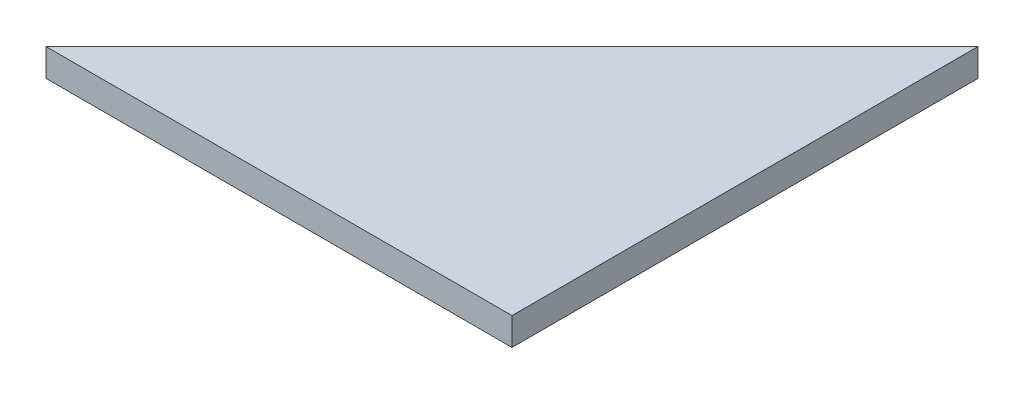
ISO-10303-21;
HEADER;
FILE_DESCRIPTION(('STEP AP214'),'2;1');
FILE_NAME('part.step','',(''),(''),'','','');
FILE_SCHEMA(('AUTOMOTIVE_DESIGN { 1 0 10303 214 1 1 1 1 }'));
ENDSEC;
DATA;
#1=APPLICATION_CONTEXT('core data for automotive mechanical design processes');
#2=APPLICATION_PROTOCOL_DEFINITION('international standard','automotive_design',2000,#1);
#3=PRODUCT_CONTEXT('',#1,'mechanical');
#4=PRODUCT('Part','Part','',(#3));
#5=PRODUCT_RELATED_PRODUCT_CATEGORY('part','',(#4));
#6=PRODUCT_DEFINITION_FORMATION('','',#4);
#7=PRODUCT_DEFINITION_CONTEXT('part definition',#1,'design');
#8=PRODUCT_DEFINITION('design','',#6,#7);
#9=PRODUCT_DEFINITION_SHAPE('','',#8);
#10=(LENGTH_UNIT() NAMED_UNIT(*) SI_UNIT(.MILLI.,.METRE.));
#11=(NAMED_UNIT(*) PLANE_ANGLE_UNIT() SI_UNIT($,.RADIAN.));
#12=(NAMED_UNIT(*) SI_UNIT($,.STERADIAN.) SOLID_ANGLE_UNIT());
#13=UNCERTAINTY_MEASURE_WITH_UNIT(LENGTH_MEASURE(1.E-05),#10,'distance_accuracy_value','');
#14=(GEOMETRIC_REPRESENTATION_CONTEXT(3) GLOBAL_UNCERTAINTY_ASSIGNED_CONTEXT((#13)) GLOBAL_UNIT_ASSIGNED_CONTEXT((#10,
#11,#12)) REPRESENTATION_CONTEXT('',''));
#15=CARTESIAN_POINT('',(0.,0.,0.));
#16=DIRECTION('',(0.,0.,1.));
#17=DIRECTION('',(1.,0.,0.));
#18=AXIS2_PLACEMENT_3D('',#15,#16,#17);
#19=CARTESIAN_POINT('',(53.640001,3.175,0.));
#20=DIRECTION('',(0.,0.,-1.));
#21=DIRECTION('',(-1.,0.,0.));
#22=AXIS2_PLACEMENT_3D('',#19,#20,#21);
#23=PLANE('',#22);
#24=DIRECTION('',(1.,0.,0.));
#25=VECTOR('',#24,1.);
#26=CARTESIAN_POINT('',(53.640001,0.,0.));
#27=LINE('',#26,#25);
#28=CARTESIAN_POINT('',(0.,0.,0.));
#29=VERTEX_POINT('',#28);
#30=CARTESIAN_POINT('',(53.640001,0.,0.));
#31=VERTEX_POINT('',#30);
#32=EDGE_CURVE('E88',#29,#31,#27,.T.);
#33=ORIENTED_EDGE('',*,*,#32,.T.);
#34=DIRECTION('',(0.,-1.,0.));
#35=VECTOR('',#34,1.);
#36=CARTESIAN_POINT('',(53.640001,3.175,0.));
#37=LINE('',#36,#35);
#38=CARTESIAN_POINT('',(53.640001,3.175,0.));
#39=VERTEX_POINT('',#38);
#40=EDGE_CURVE('E11',#39,#31,#37,.T.);
#41=ORIENTED_EDGE('',*,*,#40,.F.);
#42=DIRECTION('',(1.,0.,0.));
#43=VECTOR('',#42,1.);
#44=CARTESIAN_POINT('',(53.640001,3.175,0.));
#45=LINE('',#44,#43);
#46=CARTESIAN_POINT('',(0.,3.175,0.));
#47=VERTEX_POINT('',#46);
#48=EDGE_CURVE('E80',#47,#39,#45,.T.);
#49=ORIENTED_EDGE('',*,*,#48,.F.);
#50=DIRECTION('',(0.,-1.,0.));
#51=VECTOR('',#50,1.);
#52=CARTESIAN_POINT('',(0.,3.175,0.));
#53=LINE('',#52,#51);
#54=EDGE_CURVE('E89',#47,#29,#53,.T.);
#55=ORIENTED_EDGE('',*,*,#54,.T.);
#56=EDGE_LOOP('',(#33,#41,#49,#55));
#57=FACE_BOUND('',#56,.T.);
#58=ADVANCED_FACE('F38',(#57),#23,.F.);
#59=CARTESIAN_POINT('',(53.640001,3.175,-53.6400009999994));
#60=DIRECTION('',(-1.,0.,0.));
#61=DIRECTION('',(0.,0.,1.));
#62=AXIS2_PLACEMENT_3D('',#59,#60,#61);
#63=PLANE('',#62);
#64=DIRECTION('',(0.,0.,-1.));
#65=VECTOR('',#64,1.);
#66=CARTESIAN_POINT('',(53.640001,0.,-53.6400009999994));
#67=LINE('',#66,#65);
#68=CARTESIAN_POINT('',(53.640001,0.,-53.6400009999994));
#69=VERTEX_POINT('',#68);
#70=EDGE_CURVE('E67',#31,#69,#67,.T.);
#71=ORIENTED_EDGE('',*,*,#70,.T.);
#72=DIRECTION('',(0.,-1.,0.));
#73=VECTOR('',#72,1.);
#74=CARTESIAN_POINT('',(53.640001,3.175,-53.6400009999994));
#75=LINE('',#74,#73);
#76=CARTESIAN_POINT('',(53.640001,3.175,-53.6400009999994));
#77=VERTEX_POINT('',#76);
#78=EDGE_CURVE('E47',#77,#69,#75,.T.);
#79=ORIENTED_EDGE('',*,*,#78,.F.);
#80=DIRECTION('',(0.,0.,-1.));
#81=VECTOR('',#80,1.);
#82=CARTESIAN_POINT('',(53.640001,3.175,-53.6400009999994));
#83=LINE('',#82,#81);
#84=EDGE_CURVE('E75',#39,#77,#83,.T.);
#85=ORIENTED_EDGE('',*,*,#84,.F.);
#86=ORIENTED_EDGE('',*,*,#40,.T.);
#87=EDGE_LOOP('',(#71,#79,#85,#86));
#88=FACE_BOUND('',#87,.T.);
#89=ADVANCED_FACE('F76',(#88),#63,.F.);
#90=CARTESIAN_POINT('',(0.,3.175,0.));
#91=DIRECTION('',(0.707106781186544,0.,0.707106781186551));
#92=DIRECTION('',(0.707106781186551,0.,-0.707106781186544));
#93=AXIS2_PLACEMENT_3D('',#90,#91,#92);
#94=PLANE('',#93);
#95=DIRECTION('',(-0.707106781186551,0.,0.707106781186544));
#96=VECTOR('',#95,1.);
#97=CARTESIAN_POINT('',(0.,0.,0.));
#98=LINE('',#97,#96);
#99=EDGE_CURVE('E72',#69,#29,#98,.T.);
#100=ORIENTED_EDGE('',*,*,#99,.T.);
#101=ORIENTED_EDGE('',*,*,#54,.F.);
#102=DIRECTION('',(-0.707106781186551,0.,0.707106781186544));
#103=VECTOR('',#102,1.);
#104=CARTESIAN_POINT('',(0.,3.175,0.));
#105=LINE('',#104,#103);
#106=EDGE_CURVE('E55',#77,#47,#105,.T.);
#107=ORIENTED_EDGE('',*,*,#106,.F.);
#108=ORIENTED_EDGE('',*,*,#78,.T.);
#109=EDGE_LOOP('',(#100,#101,#107,#108));
#110=FACE_BOUND('',#109,.T.);
#111=ADVANCED_FACE('F101',(#110),#94,.F.);
#112=CARTESIAN_POINT('',(0.,3.175,0.));
#113=DIRECTION('',(0.,1.,0.));
#114=DIRECTION('',(0.,0.,1.));
#115=AXIS2_PLACEMENT_3D('',#112,#113,#114);
#116=PLANE('',#115);
#117=ORIENTED_EDGE('',*,*,#48,.T.);
#118=ORIENTED_EDGE('',*,*,#84,.T.);
#119=ORIENTED_EDGE('',*,*,#106,.T.);
#120=EDGE_LOOP('',(#117,#118,#119));
#121=FACE_BOUND('',#120,.T.);
#122=ADVANCED_FACE('F83',(#121),#116,.T.);
#123=CARTESIAN_POINT('',(0.,0.,0.));
#124=DIRECTION('',(0.,1.,0.));
#125=DIRECTION('',(0.,0.,1.));
#126=AXIS2_PLACEMENT_3D('',#123,#124,#125);
#127=PLANE('',#126);
#128=ORIENTED_EDGE('',*,*,#32,.F.);
#129=ORIENTED_EDGE('',*,*,#99,.F.);
#130=ORIENTED_EDGE('',*,*,#70,.F.);
#131=EDGE_LOOP('',(#128,#129,#130));
#132=FACE_BOUND('',#131,.T.);
#133=ADVANCED_FACE('F102',(#132),#127,.F.);
#134=CLOSED_SHELL('',(#58,#89,#111,#122,#133));
#135=MANIFOLD_SOLID_BREP('B2',#134);
#136=ADVANCED_BREP_SHAPE_REPRESENTATION('',(#18,#135),#14);
#137=SHAPE_DEFINITION_REPRESENTATION(#9,#136);
ENDSEC;
END-ISO-10303-21;
